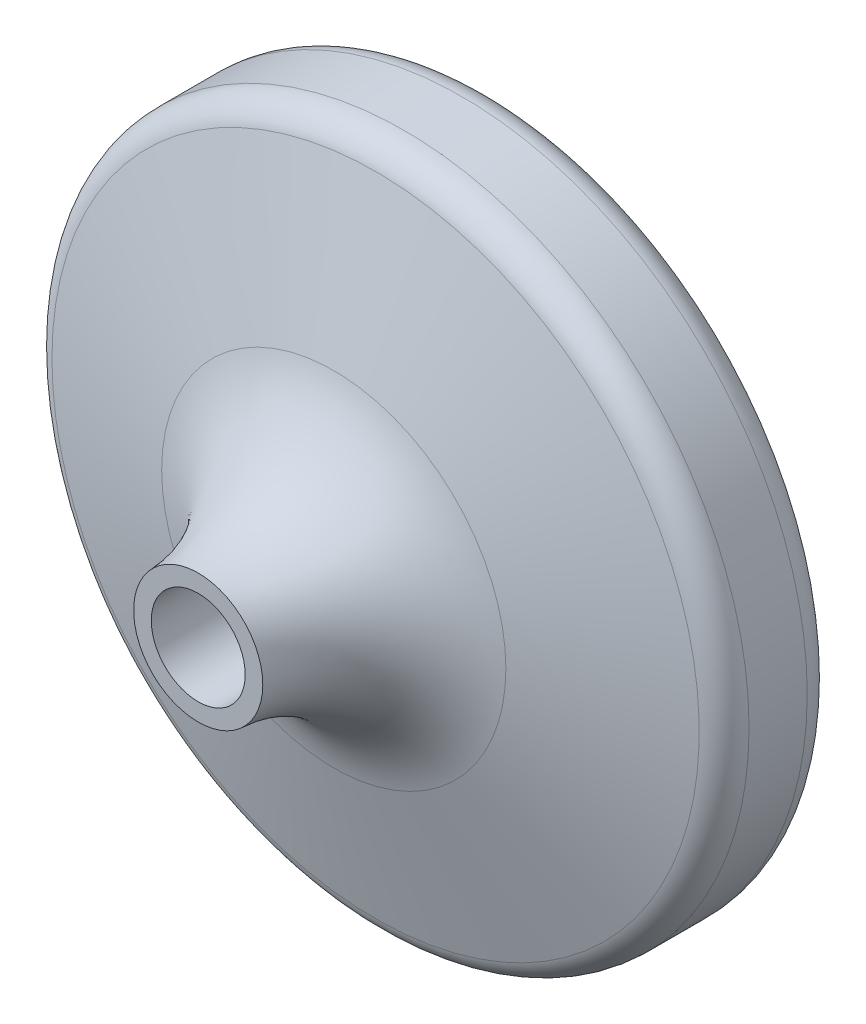
ISO-10303-21;
HEADER;
FILE_DESCRIPTION(('STEP AP214'),'2;1');
FILE_NAME('part.step','',(''),(''),'','','');
FILE_SCHEMA(('AUTOMOTIVE_DESIGN { 1 0 10303 214 1 1 1 1 }'));
ENDSEC;
DATA;
#1=APPLICATION_CONTEXT('core data for automotive mechanical design processes');
#2=APPLICATION_PROTOCOL_DEFINITION('international standard','automotive_design',2000,#1);
#3=PRODUCT_CONTEXT('',#1,'mechanical');
#4=PRODUCT('Part','Part','',(#3));
#5=PRODUCT_RELATED_PRODUCT_CATEGORY('part','',(#4));
#6=PRODUCT_DEFINITION_FORMATION('','',#4);
#7=PRODUCT_DEFINITION_CONTEXT('part definition',#1,'design');
#8=PRODUCT_DEFINITION('design','',#6,#7);
#9=PRODUCT_DEFINITION_SHAPE('','',#8);
#10=(LENGTH_UNIT() NAMED_UNIT(*) SI_UNIT(.MILLI.,.METRE.));
#11=(NAMED_UNIT(*) PLANE_ANGLE_UNIT() SI_UNIT($,.RADIAN.));
#12=(NAMED_UNIT(*) SI_UNIT($,.STERADIAN.) SOLID_ANGLE_UNIT());
#13=UNCERTAINTY_MEASURE_WITH_UNIT(LENGTH_MEASURE(1.E-05),#10,'distance_accuracy_value','');
#14=(GEOMETRIC_REPRESENTATION_CONTEXT(3) GLOBAL_UNCERTAINTY_ASSIGNED_CONTEXT((#13)) GLOBAL_UNIT_ASSIGNED_CONTEXT((#10,
#11,#12)) REPRESENTATION_CONTEXT('',''));
#15=CARTESIAN_POINT('',(0.,0.,0.));
#16=DIRECTION('',(0.,0.,1.));
#17=DIRECTION('',(1.,0.,0.));
#18=AXIS2_PLACEMENT_3D('',#15,#16,#17);
#19=CARTESIAN_POINT('',(0.,0.,40.));
#20=DIRECTION('',(0.,0.,-1.));
#21=DIRECTION('',(-1.,0.,0.));
#22=AXIS2_PLACEMENT_3D('',#19,#20,#21);
#23=CYLINDRICAL_SURFACE('',#22,8.);
#24=CARTESIAN_POINT('',(0.,0.,-22.7917603912249));
#25=DIRECTION('',(0.,0.,1.));
#26=DIRECTION('',(1.,0.,0.));
#27=AXIS2_PLACEMENT_3D('',#24,#25,#26);
#28=CIRCLE('',#27,8.);
#29=CARTESIAN_POINT('',(8.,0.,-22.7917603912249));
#30=VERTEX_POINT('',#29);
#31=EDGE_CURVE('E108',#30,#30,#28,.F.);
#32=ORIENTED_EDGE('',*,*,#31,.F.);
#33=EDGE_LOOP('',(#32));
#34=FACE_BOUND('',#33,.T.);
#35=CARTESIAN_POINT('',(0.,0.,-40.));
#36=DIRECTION('',(0.,0.,1.));
#37=DIRECTION('',(1.,0.,0.));
#38=AXIS2_PLACEMENT_3D('',#35,#36,#37);
#39=CIRCLE('',#38,8.);
#40=CARTESIAN_POINT('',(8.,0.,-40.));
#41=VERTEX_POINT('',#40);
#42=EDGE_CURVE('E94',#41,#41,#39,.T.);
#43=ORIENTED_EDGE('',*,*,#42,.F.);
#44=EDGE_LOOP('',(#43));
#45=FACE_BOUND('',#44,.T.);
#46=ADVANCED_FACE('F33',(#34,#45),#23,.F.);
#47=CARTESIAN_POINT('',(0.,0.,-40.));
#48=DIRECTION('',(0.,0.,1.));
#49=DIRECTION('',(1.,0.,0.));
#50=AXIS2_PLACEMENT_3D('',#47,#48,#49);
#51=PLANE('',#50);
#52=CARTESIAN_POINT('',(0.,0.,-40.));
#53=DIRECTION('',(0.,0.,1.));
#54=DIRECTION('',(1.,0.,0.));
#55=AXIS2_PLACEMENT_3D('',#52,#53,#54);
#56=CIRCLE('',#55,11.);
#57=CARTESIAN_POINT('',(11.,0.,-40.));
#58=VERTEX_POINT('',#57);
#59=EDGE_CURVE('E93',#58,#58,#56,.T.);
#60=ORIENTED_EDGE('',*,*,#59,.F.);
#61=EDGE_LOOP('',(#60));
#62=FACE_BOUND('',#61,.T.);
#63=ORIENTED_EDGE('',*,*,#42,.T.);
#64=EDGE_LOOP('',(#63));
#65=FACE_BOUND('',#64,.T.);
#66=ADVANCED_FACE('F50',(#62,#65),#51,.F.);
#67=CARTESIAN_POINT('',(0.,0.,-25.));
#68=DIRECTION('',(0.,0.,1.));
#69=DIRECTION('',(1.,0.,0.));
#70=AXIS2_PLACEMENT_3D('',#67,#68,#69);
#71=CONICAL_SURFACE('',#70,0.,1.30147283092055);
#72=ORIENTED_EDGE('',*,*,#31,.T.);
#73=EDGE_LOOP('',(#72));
#74=FACE_BOUND('',#73,.T.);
#75=CARTESIAN_POINT('',(0.,0.,-25.));
#76=VERTEX_POINT('',#75);
#77=VERTEX_LOOP('',#76);
#78=FACE_BOUND('',#77,.T.);
#79=ADVANCED_FACE('F47',(#74,#78),#71,.T.);
#80=CARTESIAN_POINT('',(0.,0.,-16.9046292453596));
#81=DIRECTION('',(0.,0.,1.));
#82=DIRECTION('',(1.,0.,0.));
#83=AXIS2_PLACEMENT_3D('',#80,#81,#82);
#84=CIRCLE('',#83,29.3278708432583);
#85=CARTESIAN_POINT('',(29.3278708432583,0.,-16.9046292453596));
#86=VERTEX_POINT('',#85);
#87=EDGE_CURVE('E41',#86,#86,#84,.T.);
#88=ORIENTED_EDGE('',*,*,#87,.T.);
#89=EDGE_LOOP('',(#88));
#90=FACE_BOUND('',#89,.T.);
#91=CARTESIAN_POINT('',(0.,0.,-9.77795076560508));
#92=DIRECTION('',(0.,0.,-1.));
#93=DIRECTION('',(-1.,0.,0.));
#94=AXIS2_PLACEMENT_3D('',#91,#92,#93);
#95=CIRCLE('',#94,55.1463678992285);
#96=CARTESIAN_POINT('',(-55.1463678992285,0.,-9.77795076560508));
#97=VERTEX_POINT('',#96);
#98=EDGE_CURVE('E100',#97,#97,#95,.T.);
#99=ORIENTED_EDGE('',*,*,#98,.T.);
#100=EDGE_LOOP('',(#99));
#101=FACE_BOUND('',#100,.T.);
#102=ADVANCED_FACE('F49',(#90,#101),#71,.T.);
#103=CARTESIAN_POINT('',(0.,0.,9.77795076560508));
#104=DIRECTION('',(0.,0.,-1.));
#105=DIRECTION('',(-1.,0.,0.));
#106=AXIS2_PLACEMENT_3D('',#103,#104,#105);
#107=CONICAL_SURFACE('',#106,55.1463678992285,1.30147283092055);
#108=CARTESIAN_POINT('',(0.,0.,16.9046292453596));
#109=DIRECTION('',(0.,0.,-1.));
#110=DIRECTION('',(-1.,0.,0.));
#111=AXIS2_PLACEMENT_3D('',#108,#109,#110);
#112=CIRCLE('',#111,29.3278708432583);
#113=CARTESIAN_POINT('',(-29.3278708432583,0.,16.9046292453596));
#114=VERTEX_POINT('',#113);
#115=EDGE_CURVE('E11',#114,#114,#112,.T.);
#116=ORIENTED_EDGE('',*,*,#115,.T.);
#117=EDGE_LOOP('',(#116));
#118=FACE_BOUND('',#117,.T.);
#119=CARTESIAN_POINT('',(0.,0.,9.77795076560508));
#120=DIRECTION('',(0.,0.,-1.));
#121=DIRECTION('',(-1.,0.,0.));
#122=AXIS2_PLACEMENT_3D('',#119,#120,#121);
#123=CIRCLE('',#122,55.1463678992285);
#124=CARTESIAN_POINT('',(-55.1463678992285,0.,9.77795076560508));
#125=VERTEX_POINT('',#124);
#126=EDGE_CURVE('E133',#125,#125,#123,.T.);
#127=ORIENTED_EDGE('',*,*,#126,.F.);
#128=EDGE_LOOP('',(#127));
#129=FACE_BOUND('',#128,.T.);
#130=ADVANCED_FACE('F57',(#118,#129),#107,.T.);
#131=CARTESIAN_POINT('',(0.,0.,-4.95819516195084));
#132=DIRECTION('',(0.,0.,-1.));
#133=DIRECTION('',(-1.,0.,0.));
#134=AXIS2_PLACEMENT_3D('',#131,#132,#133);
#135=TOROIDAL_SURFACE('',#134,53.8159709956528,5.);
#136=CARTESIAN_POINT('',(0.,0.,-4.95819516195084));
#137=DIRECTION('',(0.,0.,-1.));
#138=DIRECTION('',(-1.,0.,0.));
#139=AXIS2_PLACEMENT_3D('',#136,#137,#138);
#140=CIRCLE('',#139,58.8159709956528);
#141=CARTESIAN_POINT('',(-58.8159709956528,0.,-4.95819516195084));
#142=VERTEX_POINT('',#141);
#143=EDGE_CURVE('E138',#142,#142,#140,.T.);
#144=ORIENTED_EDGE('',*,*,#143,.T.);
#145=EDGE_LOOP('',(#144));
#146=FACE_BOUND('',#145,.T.);
#147=ORIENTED_EDGE('',*,*,#98,.F.);
#148=EDGE_LOOP('',(#147));
#149=FACE_BOUND('',#148,.T.);
#150=ADVANCED_FACE('F130',(#146,#149),#135,.T.);
#151=CARTESIAN_POINT('',(0.,0.,-25.));
#152=DIRECTION('',(0.,0.,-1.));
#153=DIRECTION('',(-1.,0.,0.));
#154=AXIS2_PLACEMENT_3D('',#151,#152,#153);
#155=CYLINDRICAL_SURFACE('',#154,58.8159709956528);
#156=CARTESIAN_POINT('',(0.,0.,4.95819516195084));
#157=DIRECTION('',(0.,0.,-1.));
#158=DIRECTION('',(-1.,0.,0.));
#159=AXIS2_PLACEMENT_3D('',#156,#157,#158);
#160=CIRCLE('',#159,58.8159709956528);
#161=CARTESIAN_POINT('',(-58.8159709956528,0.,4.95819516195084));
#162=VERTEX_POINT('',#161);
#163=EDGE_CURVE('E135',#162,#162,#160,.T.);
#164=ORIENTED_EDGE('',*,*,#163,.T.);
#165=EDGE_LOOP('',(#164));
#166=FACE_BOUND('',#165,.T.);
#167=ORIENTED_EDGE('',*,*,#143,.F.);
#168=EDGE_LOOP('',(#167));
#169=FACE_BOUND('',#168,.T.);
#170=ADVANCED_FACE('F147',(#166,#169),#155,.T.);
#171=CARTESIAN_POINT('',(0.,0.,4.95819516195084));
#172=DIRECTION('',(0.,0.,-1.));
#173=DIRECTION('',(-1.,0.,0.));
#174=AXIS2_PLACEMENT_3D('',#171,#172,#173);
#175=TOROIDAL_SURFACE('',#174,53.8159709956528,5.);
#176=ORIENTED_EDGE('',*,*,#126,.T.);
#177=EDGE_LOOP('',(#176));
#178=FACE_BOUND('',#177,.T.);
#179=ORIENTED_EDGE('',*,*,#163,.F.);
#180=EDGE_LOOP('',(#179));
#181=FACE_BOUND('',#180,.T.);
#182=ADVANCED_FACE('F83',(#178,#181),#175,.T.);
#183=CARTESIAN_POINT('',(0.,0.,40.));
#184=DIRECTION('',(0.,0.,1.));
#185=DIRECTION('',(1.,0.,0.));
#186=AXIS2_PLACEMENT_3D('',#183,#184,#185);
#187=PLANE('',#186);
#188=CARTESIAN_POINT('',(0.,0.,40.));
#189=DIRECTION('',(0.,0.,1.));
#190=DIRECTION('',(1.,0.,0.));
#191=AXIS2_PLACEMENT_3D('',#188,#189,#190);
#192=CIRCLE('',#191,11.);
#193=CARTESIAN_POINT('',(11.,0.,40.));
#194=VERTEX_POINT('',#193);
#195=EDGE_CURVE('E97',#194,#194,#192,.T.);
#196=ORIENTED_EDGE('',*,*,#195,.T.);
#197=EDGE_LOOP('',(#196));
#198=FACE_BOUND('',#197,.T.);
#199=CARTESIAN_POINT('',(0.,0.,40.));
#200=DIRECTION('',(0.,0.,1.));
#201=DIRECTION('',(1.,0.,0.));
#202=AXIS2_PLACEMENT_3D('',#199,#200,#201);
#203=CIRCLE('',#202,8.);
#204=CARTESIAN_POINT('',(8.,0.,40.));
#205=VERTEX_POINT('',#204);
#206=EDGE_CURVE('E91',#205,#205,#203,.T.);
#207=ORIENTED_EDGE('',*,*,#206,.F.);
#208=EDGE_LOOP('',(#207));
#209=FACE_BOUND('',#208,.T.);
#210=ADVANCED_FACE('F74',(#198,#209),#187,.T.);
#211=CARTESIAN_POINT('',(0.,0.,22.7917603912249));
#212=DIRECTION('',(0.,0.,-1.));
#213=DIRECTION('',(-1.,0.,0.));
#214=AXIS2_PLACEMENT_3D('',#211,#212,#213);
#215=CIRCLE('',#214,8.);
#216=CARTESIAN_POINT('',(-8.,0.,22.7917603912249));
#217=VERTEX_POINT('',#216);
#218=EDGE_CURVE('E88',#217,#217,#215,.F.);
#219=ORIENTED_EDGE('',*,*,#218,.F.);
#220=EDGE_LOOP('',(#219));
#221=FACE_BOUND('',#220,.T.);
#222=ORIENTED_EDGE('',*,*,#206,.T.);
#223=EDGE_LOOP('',(#222));
#224=FACE_BOUND('',#223,.T.);
#225=ADVANCED_FACE('F66',(#221,#224),#23,.F.);
#226=ORIENTED_EDGE('',*,*,#218,.T.);
#227=EDGE_LOOP('',(#226));
#228=FACE_BOUND('',#227,.T.);
#229=CARTESIAN_POINT('',(0.,0.,25.));
#230=VERTEX_POINT('',#229);
#231=VERTEX_LOOP('',#230);
#232=FACE_BOUND('',#231,.T.);
#233=ADVANCED_FACE('F73',(#228,#232),#107,.T.);
#234=CARTESIAN_POINT('',(0.,0.,-41.0034072636308));
#235=DIRECTION('',(0.,0.,-1.));
#236=DIRECTION('',(-1.,0.,0.));
#237=AXIS2_PLACEMENT_3D('',#234,#235,#236);
#238=TOROIDAL_SURFACE('',#237,35.9798553611364,25.);
#239=ORIENTED_EDGE('',*,*,#87,.F.);
#240=EDGE_LOOP('',(#239));
#241=FACE_BOUND('',#240,.T.);
#242=ORIENTED_EDGE('',*,*,#59,.T.);
#243=EDGE_LOOP('',(#242));
#244=FACE_BOUND('',#243,.T.);
#245=ADVANCED_FACE('F80',(#241,#244),#238,.F.);
#246=CARTESIAN_POINT('',(0.,0.,41.0034072636308));
#247=DIRECTION('',(0.,0.,1.));
#248=DIRECTION('',(1.,0.,0.));
#249=AXIS2_PLACEMENT_3D('',#246,#247,#248);
#250=TOROIDAL_SURFACE('',#249,35.9798553611364,25.);
#251=ORIENTED_EDGE('',*,*,#115,.F.);
#252=EDGE_LOOP('',(#251));
#253=FACE_BOUND('',#252,.T.);
#254=ORIENTED_EDGE('',*,*,#195,.F.);
#255=EDGE_LOOP('',(#254));
#256=FACE_BOUND('',#255,.T.);
#257=ADVANCED_FACE('F35',(#253,#256),#250,.F.);
#258=CLOSED_SHELL('',(#46,#66,#79,#102,#130,#150,#170,#182,#210,#225,#233,#245,#257));
#259=MANIFOLD_SOLID_BREP('B2',#258);
#260=ADVANCED_BREP_SHAPE_REPRESENTATION('',(#18,#259),#14);
#261=SHAPE_DEFINITION_REPRESENTATION(#9,#260);
ENDSEC;
END-ISO-10303-21;
